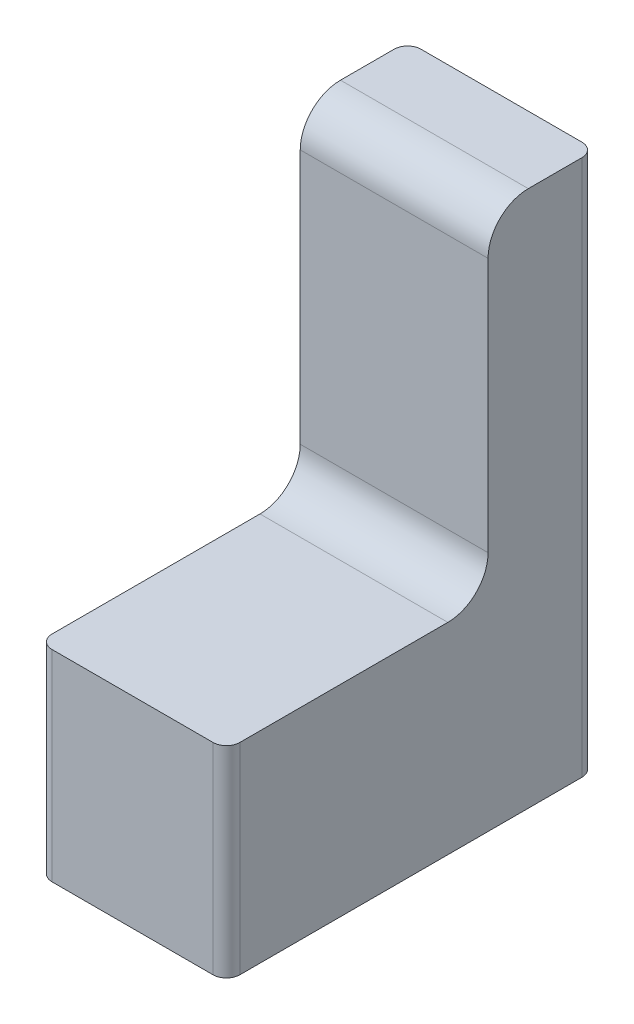
ISO-10303-21;
HEADER;
FILE_DESCRIPTION(('STEP AP214'),'2;1');
FILE_NAME('part.step','',(''),(''),'','','');
FILE_SCHEMA(('AUTOMOTIVE_DESIGN { 1 0 10303 214 1 1 1 1 }'));
ENDSEC;
DATA;
#1=APPLICATION_CONTEXT('core data for automotive mechanical design processes');
#2=APPLICATION_PROTOCOL_DEFINITION('international standard','automotive_design',2000,#1);
#3=PRODUCT_CONTEXT('',#1,'mechanical');
#4=PRODUCT('Part','Part','',(#3));
#5=PRODUCT_RELATED_PRODUCT_CATEGORY('part','',(#4));
#6=PRODUCT_DEFINITION_FORMATION('','',#4);
#7=PRODUCT_DEFINITION_CONTEXT('part definition',#1,'design');
#8=PRODUCT_DEFINITION('design','',#6,#7);
#9=PRODUCT_DEFINITION_SHAPE('','',#8);
#10=(LENGTH_UNIT() NAMED_UNIT(*) SI_UNIT(.MILLI.,.METRE.));
#11=(NAMED_UNIT(*) PLANE_ANGLE_UNIT() SI_UNIT($,.RADIAN.));
#12=(NAMED_UNIT(*) SI_UNIT($,.STERADIAN.) SOLID_ANGLE_UNIT());
#13=UNCERTAINTY_MEASURE_WITH_UNIT(LENGTH_MEASURE(1.E-05),#10,'distance_accuracy_value','');
#14=(GEOMETRIC_REPRESENTATION_CONTEXT(3) GLOBAL_UNCERTAINTY_ASSIGNED_CONTEXT((#13)) GLOBAL_UNIT_ASSIGNED_CONTEXT((#10,
#11,#12)) REPRESENTATION_CONTEXT('',''));
#15=CARTESIAN_POINT('',(0.,0.,0.));
#16=DIRECTION('',(0.,0.,1.));
#17=DIRECTION('',(1.,0.,0.));
#18=AXIS2_PLACEMENT_3D('',#15,#16,#17);
#19=CARTESIAN_POINT('',(7.,-40.,13.75));
#20=DIRECTION('',(1.,0.,0.));
#21=DIRECTION('',(0.,0.,-1.));
#22=AXIS2_PLACEMENT_3D('',#19,#20,#21);
#23=PLANE('',#22);
#24=DIRECTION('',(0.,0.,-1.));
#25=VECTOR('',#24,1.);
#26=CARTESIAN_POINT('',(7.,-40.,13.75));
#27=LINE('',#26,#25);
#28=CARTESIAN_POINT('',(7.,-40.,12.75));
#29=VERTEX_POINT('',#28);
#30=CARTESIAN_POINT('',(7.,-40.,-12.75));
#31=VERTEX_POINT('',#30);
#32=EDGE_CURVE('E184',#29,#31,#27,.T.);
#33=ORIENTED_EDGE('',*,*,#32,.T.);
#34=DIRECTION('',(0.,1.,0.));
#35=VECTOR('',#34,1.);
#36=CARTESIAN_POINT('',(7.,-40.,-12.75));
#37=LINE('',#36,#35);
#38=CARTESIAN_POINT('',(7.,0.,-12.75));
#39=VERTEX_POINT('',#38);
#40=EDGE_CURVE('E248',#31,#39,#37,.T.);
#41=ORIENTED_EDGE('',*,*,#40,.T.);
#42=DIRECTION('',(0.,0.,-1.));
#43=VECTOR('',#42,1.);
#44=CARTESIAN_POINT('',(7.,0.,13.75));
#45=LINE('',#44,#43);
#46=CARTESIAN_POINT('',(7.,0.,-8.75));
#47=VERTEX_POINT('',#46);
#48=EDGE_CURVE('E183',#47,#39,#45,.T.);
#49=ORIENTED_EDGE('',*,*,#48,.F.);
#50=CARTESIAN_POINT('',(7.,-3.,-8.75));
#51=DIRECTION('',(1.,0.,0.));
#52=DIRECTION('',(0.,0.,-1.));
#53=AXIS2_PLACEMENT_3D('',#50,#51,#52);
#54=CIRCLE('',#53,3.);
#55=CARTESIAN_POINT('',(7.,-3.,-5.75));
#56=VERTEX_POINT('',#55);
#57=EDGE_CURVE('E214',#47,#56,#54,.T.);
#58=ORIENTED_EDGE('',*,*,#57,.T.);
#59=DIRECTION('',(0.,1.,0.));
#60=VECTOR('',#59,1.);
#61=CARTESIAN_POINT('',(7.,0.,-5.75));
#62=LINE('',#61,#60);
#63=CARTESIAN_POINT('',(7.,-22.,-5.75));
#64=VERTEX_POINT('',#63);
#65=EDGE_CURVE('E176',#64,#56,#62,.T.);
#66=ORIENTED_EDGE('',*,*,#65,.F.);
#67=CARTESIAN_POINT('',(7.,-22.,-2.75));
#68=DIRECTION('',(1.,0.,0.));
#69=DIRECTION('',(0.,0.,-1.));
#70=AXIS2_PLACEMENT_3D('',#67,#68,#69);
#71=CIRCLE('',#70,3.);
#72=CARTESIAN_POINT('',(7.,-25.,-2.75));
#73=VERTEX_POINT('',#72);
#74=EDGE_CURVE('E219',#64,#73,#71,.F.);
#75=ORIENTED_EDGE('',*,*,#74,.T.);
#76=DIRECTION('',(0.,0.,-1.));
#77=VECTOR('',#76,1.);
#78=CARTESIAN_POINT('',(7.,-25.,13.75));
#79=LINE('',#78,#77);
#80=CARTESIAN_POINT('',(7.,-25.,12.75));
#81=VERTEX_POINT('',#80);
#82=EDGE_CURVE('E174',#81,#73,#79,.T.);
#83=ORIENTED_EDGE('',*,*,#82,.F.);
#84=DIRECTION('',(0.,1.,0.));
#85=VECTOR('',#84,1.);
#86=CARTESIAN_POINT('',(7.,-40.,12.75));
#87=LINE('',#86,#85);
#88=EDGE_CURVE('E246',#81,#29,#87,.F.);
#89=ORIENTED_EDGE('',*,*,#88,.T.);
#90=EDGE_LOOP('',(#33,#41,#49,#58,#66,#75,#83,#89));
#91=FACE_BOUND('',#90,.T.);
#92=ADVANCED_FACE('F53',(#91),#23,.T.);
#93=CARTESIAN_POINT('',(-7.,-40.,13.75));
#94=DIRECTION('',(0.,0.,1.));
#95=DIRECTION('',(1.,0.,0.));
#96=AXIS2_PLACEMENT_3D('',#93,#94,#95);
#97=PLANE('',#96);
#98=DIRECTION('',(1.,0.,0.));
#99=VECTOR('',#98,1.);
#100=CARTESIAN_POINT('',(-7.,-40.,13.75));
#101=LINE('',#100,#99);
#102=CARTESIAN_POINT('',(-6.,-40.,13.75));
#103=VERTEX_POINT('',#102);
#104=CARTESIAN_POINT('',(6.,-40.,13.75));
#105=VERTEX_POINT('',#104);
#106=EDGE_CURVE('E194',#103,#105,#101,.T.);
#107=ORIENTED_EDGE('',*,*,#106,.T.);
#108=DIRECTION('',(0.,1.,0.));
#109=VECTOR('',#108,1.);
#110=CARTESIAN_POINT('',(6.,-40.,13.75));
#111=LINE('',#110,#109);
#112=CARTESIAN_POINT('',(6.,-25.,13.75));
#113=VERTEX_POINT('',#112);
#114=EDGE_CURVE('E253',#105,#113,#111,.T.);
#115=ORIENTED_EDGE('',*,*,#114,.T.);
#116=DIRECTION('',(1.,0.,0.));
#117=VECTOR('',#116,1.);
#118=CARTESIAN_POINT('',(-7.001,-25.,13.75));
#119=LINE('',#118,#117);
#120=CARTESIAN_POINT('',(-6.,-25.,13.75));
#121=VERTEX_POINT('',#120);
#122=EDGE_CURVE('E179',#121,#113,#119,.T.);
#123=ORIENTED_EDGE('',*,*,#122,.F.);
#124=DIRECTION('',(0.,1.,0.));
#125=VECTOR('',#124,1.);
#126=CARTESIAN_POINT('',(-6.,-40.,13.75));
#127=LINE('',#126,#125);
#128=EDGE_CURVE('E251',#121,#103,#127,.F.);
#129=ORIENTED_EDGE('',*,*,#128,.T.);
#130=EDGE_LOOP('',(#107,#115,#123,#129));
#131=FACE_BOUND('',#130,.T.);
#132=ADVANCED_FACE('F255',(#131),#97,.T.);
#133=CARTESIAN_POINT('',(-7.,-40.,13.75));
#134=DIRECTION('',(-1.,0.,0.));
#135=DIRECTION('',(0.,0.,1.));
#136=AXIS2_PLACEMENT_3D('',#133,#134,#135);
#137=PLANE('',#136);
#138=DIRECTION('',(0.,0.,1.));
#139=VECTOR('',#138,1.);
#140=CARTESIAN_POINT('',(-7.,0.,13.75));
#141=LINE('',#140,#139);
#142=CARTESIAN_POINT('',(-7.,0.,-12.75));
#143=VERTEX_POINT('',#142);
#144=CARTESIAN_POINT('',(-7.,0.,-8.75));
#145=VERTEX_POINT('',#144);
#146=EDGE_CURVE('E188',#143,#145,#141,.T.);
#147=ORIENTED_EDGE('',*,*,#146,.F.);
#148=DIRECTION('',(0.,1.,0.));
#149=VECTOR('',#148,1.);
#150=CARTESIAN_POINT('',(-7.,-40.,-12.75));
#151=LINE('',#150,#149);
#152=CARTESIAN_POINT('',(-7.,-40.,-12.75));
#153=VERTEX_POINT('',#152);
#154=EDGE_CURVE('E236',#143,#153,#151,.F.);
#155=ORIENTED_EDGE('',*,*,#154,.T.);
#156=DIRECTION('',(0.,0.,1.));
#157=VECTOR('',#156,1.);
#158=CARTESIAN_POINT('',(-7.,-40.,13.75));
#159=LINE('',#158,#157);
#160=CARTESIAN_POINT('',(-7.,-40.,12.75));
#161=VERTEX_POINT('',#160);
#162=EDGE_CURVE('E191',#153,#161,#159,.T.);
#163=ORIENTED_EDGE('',*,*,#162,.T.);
#164=DIRECTION('',(0.,1.,0.));
#165=VECTOR('',#164,1.);
#166=CARTESIAN_POINT('',(-7.,-40.,12.75));
#167=LINE('',#166,#165);
#168=CARTESIAN_POINT('',(-7.,-25.,12.75));
#169=VERTEX_POINT('',#168);
#170=EDGE_CURVE('E233',#161,#169,#167,.T.);
#171=ORIENTED_EDGE('',*,*,#170,.T.);
#172=DIRECTION('',(0.,0.,-1.));
#173=VECTOR('',#172,1.);
#174=CARTESIAN_POINT('',(-7.,-25.,13.75));
#175=LINE('',#174,#173);
#176=CARTESIAN_POINT('',(-7.,-25.,-2.75));
#177=VERTEX_POINT('',#176);
#178=EDGE_CURVE('E181',#169,#177,#175,.T.);
#179=ORIENTED_EDGE('',*,*,#178,.T.);
#180=CARTESIAN_POINT('',(-7.,-22.,-2.75));
#181=DIRECTION('',(-1.,0.,0.));
#182=DIRECTION('',(0.,0.,1.));
#183=AXIS2_PLACEMENT_3D('',#180,#181,#182);
#184=CIRCLE('',#183,3.);
#185=CARTESIAN_POINT('',(-7.,-22.,-5.75));
#186=VERTEX_POINT('',#185);
#187=EDGE_CURVE('E222',#177,#186,#184,.F.);
#188=ORIENTED_EDGE('',*,*,#187,.T.);
#189=DIRECTION('',(0.,1.,0.));
#190=VECTOR('',#189,1.);
#191=CARTESIAN_POINT('',(-7.,0.,-5.75));
#192=LINE('',#191,#190);
#193=CARTESIAN_POINT('',(-7.,-3.,-5.75));
#194=VERTEX_POINT('',#193);
#195=EDGE_CURVE('E171',#186,#194,#192,.T.);
#196=ORIENTED_EDGE('',*,*,#195,.T.);
#197=CARTESIAN_POINT('',(-7.,-3.,-8.75));
#198=DIRECTION('',(-1.,0.,0.));
#199=DIRECTION('',(0.,0.,1.));
#200=AXIS2_PLACEMENT_3D('',#197,#198,#199);
#201=CIRCLE('',#200,3.);
#202=EDGE_CURVE('E216',#194,#145,#201,.T.);
#203=ORIENTED_EDGE('',*,*,#202,.T.);
#204=EDGE_LOOP('',(#147,#155,#163,#171,#179,#188,#196,#203));
#205=FACE_BOUND('',#204,.T.);
#206=ADVANCED_FACE('F289',(#205),#137,.T.);
#207=CARTESIAN_POINT('',(-7.,-40.,-13.75));
#208=DIRECTION('',(0.,0.,-1.));
#209=DIRECTION('',(-1.,0.,0.));
#210=AXIS2_PLACEMENT_3D('',#207,#208,#209);
#211=PLANE('',#210);
#212=DIRECTION('',(-1.,0.,0.));
#213=VECTOR('',#212,1.);
#214=CARTESIAN_POINT('',(-7.,-40.,-13.75));
#215=LINE('',#214,#213);
#216=CARTESIAN_POINT('',(6.,-40.,-13.75));
#217=VERTEX_POINT('',#216);
#218=CARTESIAN_POINT('',(-6.,-40.,-13.75));
#219=VERTEX_POINT('',#218);
#220=EDGE_CURVE('E187',#217,#219,#215,.T.);
#221=ORIENTED_EDGE('',*,*,#220,.T.);
#222=DIRECTION('',(0.,1.,0.));
#223=VECTOR('',#222,1.);
#224=CARTESIAN_POINT('',(-6.,-40.,-13.75));
#225=LINE('',#224,#223);
#226=CARTESIAN_POINT('',(-6.,0.,-13.75));
#227=VERTEX_POINT('',#226);
#228=EDGE_CURVE('E226',#219,#227,#225,.T.);
#229=ORIENTED_EDGE('',*,*,#228,.T.);
#230=DIRECTION('',(-1.,0.,0.));
#231=VECTOR('',#230,1.);
#232=CARTESIAN_POINT('',(-7.,0.,-13.75));
#233=LINE('',#232,#231);
#234=CARTESIAN_POINT('',(6.,0.,-13.75));
#235=VERTEX_POINT('',#234);
#236=EDGE_CURVE('E200',#235,#227,#233,.T.);
#237=ORIENTED_EDGE('',*,*,#236,.F.);
#238=DIRECTION('',(0.,1.,0.));
#239=VECTOR('',#238,1.);
#240=CARTESIAN_POINT('',(6.,-40.,-13.75));
#241=LINE('',#240,#239);
#242=EDGE_CURVE('E224',#235,#217,#241,.F.);
#243=ORIENTED_EDGE('',*,*,#242,.T.);
#244=EDGE_LOOP('',(#221,#229,#237,#243));
#245=FACE_BOUND('',#244,.T.);
#246=ADVANCED_FACE('F281',(#245),#211,.T.);
#247=CARTESIAN_POINT('',(0.,-40.,0.));
#248=DIRECTION('',(0.,-1.,0.));
#249=DIRECTION('',(0.,0.,-1.));
#250=AXIS2_PLACEMENT_3D('',#247,#248,#249);
#251=PLANE('',#250);
#252=CARTESIAN_POINT('',(0.,-40.,7.75));
#253=DIRECTION('',(0.,-1.,0.));
#254=DIRECTION('',(0.,0.,-1.));
#255=AXIS2_PLACEMENT_3D('',#252,#253,#254);
#256=CIRCLE('',#255,3.025);
#257=CARTESIAN_POINT('',(0.,-40.,4.725));
#258=VERTEX_POINT('',#257);
#259=EDGE_CURVE('E162',#258,#258,#256,.T.);
#260=ORIENTED_EDGE('',*,*,#259,.F.);
#261=EDGE_LOOP('',(#260));
#262=FACE_BOUND('',#261,.T.);
#263=CARTESIAN_POINT('',(0.,-40.,-7.75));
#264=DIRECTION('',(0.,-1.,0.));
#265=DIRECTION('',(0.,0.,-1.));
#266=AXIS2_PLACEMENT_3D('',#263,#264,#265);
#267=CIRCLE('',#266,3.025);
#268=CARTESIAN_POINT('',(0.,-40.,-10.775));
#269=VERTEX_POINT('',#268);
#270=EDGE_CURVE('E155',#269,#269,#267,.T.);
#271=ORIENTED_EDGE('',*,*,#270,.F.);
#272=EDGE_LOOP('',(#271));
#273=FACE_BOUND('',#272,.T.);
#274=ORIENTED_EDGE('',*,*,#162,.F.);
#275=CARTESIAN_POINT('',(-6.,-40.,-12.75));
#276=DIRECTION('',(0.,-1.,0.));
#277=DIRECTION('',(0.,0.,-1.));
#278=AXIS2_PLACEMENT_3D('',#275,#276,#277);
#279=CIRCLE('',#278,1.);
#280=EDGE_CURVE('E244',#153,#219,#279,.T.);
#281=ORIENTED_EDGE('',*,*,#280,.T.);
#282=ORIENTED_EDGE('',*,*,#220,.F.);
#283=CARTESIAN_POINT('',(6.,-40.,-12.75));
#284=DIRECTION('',(0.,-1.,0.));
#285=DIRECTION('',(0.,0.,-1.));
#286=AXIS2_PLACEMENT_3D('',#283,#284,#285);
#287=CIRCLE('',#286,1.);
#288=EDGE_CURVE('E242',#217,#31,#287,.T.);
#289=ORIENTED_EDGE('',*,*,#288,.T.);
#290=ORIENTED_EDGE('',*,*,#32,.F.);
#291=CARTESIAN_POINT('',(6.,-40.,12.75));
#292=DIRECTION('',(0.,-1.,0.));
#293=DIRECTION('',(0.,0.,-1.));
#294=AXIS2_PLACEMENT_3D('',#291,#292,#293);
#295=CIRCLE('',#294,1.);
#296=EDGE_CURVE('E240',#29,#105,#295,.T.);
#297=ORIENTED_EDGE('',*,*,#296,.T.);
#298=ORIENTED_EDGE('',*,*,#106,.F.);
#299=CARTESIAN_POINT('',(-6.,-40.,12.75));
#300=DIRECTION('',(0.,-1.,0.));
#301=DIRECTION('',(0.,0.,-1.));
#302=AXIS2_PLACEMENT_3D('',#299,#300,#301);
#303=CIRCLE('',#302,1.);
#304=EDGE_CURVE('E238',#103,#161,#303,.T.);
#305=ORIENTED_EDGE('',*,*,#304,.T.);
#306=EDGE_LOOP('',(#274,#281,#282,#289,#290,#297,#298,#305));
#307=FACE_BOUND('',#306,.T.);
#308=ADVANCED_FACE('F268',(#262,#273,#307),#251,.T.);
#309=CARTESIAN_POINT('',(0.,0.,0.));
#310=DIRECTION('',(0.,-1.,0.));
#311=DIRECTION('',(0.,0.,-1.));
#312=AXIS2_PLACEMENT_3D('',#309,#310,#311);
#313=PLANE('',#312);
#314=ORIENTED_EDGE('',*,*,#236,.T.);
#315=CARTESIAN_POINT('',(-6.,0.,-12.75));
#316=DIRECTION('',(0.,-1.,0.));
#317=DIRECTION('',(0.,0.,-1.));
#318=AXIS2_PLACEMENT_3D('',#315,#316,#317);
#319=CIRCLE('',#318,1.);
#320=EDGE_CURVE('E231',#227,#143,#319,.F.);
#321=ORIENTED_EDGE('',*,*,#320,.T.);
#322=ORIENTED_EDGE('',*,*,#146,.T.);
#323=DIRECTION('',(1.,0.,0.));
#324=VECTOR('',#323,1.);
#325=CARTESIAN_POINT('',(0.,0.,-8.75));
#326=LINE('',#325,#324);
#327=EDGE_CURVE('E211',#145,#47,#326,.T.);
#328=ORIENTED_EDGE('',*,*,#327,.T.);
#329=ORIENTED_EDGE('',*,*,#48,.T.);
#330=CARTESIAN_POINT('',(6.,0.,-12.75));
#331=DIRECTION('',(0.,-1.,0.));
#332=DIRECTION('',(0.,0.,-1.));
#333=AXIS2_PLACEMENT_3D('',#330,#331,#332);
#334=CIRCLE('',#333,1.);
#335=EDGE_CURVE('E229',#39,#235,#334,.F.);
#336=ORIENTED_EDGE('',*,*,#335,.T.);
#337=EDGE_LOOP('',(#314,#321,#322,#328,#329,#336));
#338=FACE_BOUND('',#337,.T.);
#339=ADVANCED_FACE('F279',(#338),#313,.F.);
#340=CARTESIAN_POINT('',(-7.001,0.,-5.75));
#341=DIRECTION('',(0.,0.,-1.));
#342=DIRECTION('',(0.,1.,0.));
#343=AXIS2_PLACEMENT_3D('',#340,#341,#342);
#344=PLANE('',#343);
#345=ORIENTED_EDGE('',*,*,#195,.F.);
#346=DIRECTION('',(1.,0.,0.));
#347=VECTOR('',#346,1.);
#348=CARTESIAN_POINT('',(7.,-22.,-5.75));
#349=LINE('',#348,#347);
#350=EDGE_CURVE('E205',#186,#64,#349,.T.);
#351=ORIENTED_EDGE('',*,*,#350,.T.);
#352=ORIENTED_EDGE('',*,*,#65,.T.);
#353=DIRECTION('',(1.,0.,0.));
#354=VECTOR('',#353,1.);
#355=CARTESIAN_POINT('',(-7.001,-3.,-5.75));
#356=LINE('',#355,#354);
#357=EDGE_CURVE('E197',#56,#194,#356,.F.);
#358=ORIENTED_EDGE('',*,*,#357,.T.);
#359=EDGE_LOOP('',(#345,#351,#352,#358));
#360=FACE_BOUND('',#359,.T.);
#361=ADVANCED_FACE('F297',(#360),#344,.F.);
#362=CARTESIAN_POINT('',(-7.001,-25.,13.75));
#363=DIRECTION('',(0.,-1.,0.));
#364=DIRECTION('',(0.,0.,-1.));
#365=AXIS2_PLACEMENT_3D('',#362,#363,#364);
#366=PLANE('',#365);
#367=ORIENTED_EDGE('',*,*,#122,.T.);
#368=CARTESIAN_POINT('',(6.,-25.,12.75));
#369=DIRECTION('',(0.,-1.,0.));
#370=DIRECTION('',(0.,0.,-1.));
#371=AXIS2_PLACEMENT_3D('',#368,#369,#370);
#372=CIRCLE('',#371,1.);
#373=EDGE_CURVE('E11',#113,#81,#372,.F.);
#374=ORIENTED_EDGE('',*,*,#373,.T.);
#375=ORIENTED_EDGE('',*,*,#82,.T.);
#376=DIRECTION('',(1.,0.,0.));
#377=VECTOR('',#376,1.);
#378=CARTESIAN_POINT('',(-7.,-25.,-2.75));
#379=LINE('',#378,#377);
#380=EDGE_CURVE('E208',#73,#177,#379,.F.);
#381=ORIENTED_EDGE('',*,*,#380,.T.);
#382=ORIENTED_EDGE('',*,*,#178,.F.);
#383=CARTESIAN_POINT('',(-6.,-25.,12.75));
#384=DIRECTION('',(0.,-1.,0.));
#385=DIRECTION('',(0.,0.,-1.));
#386=AXIS2_PLACEMENT_3D('',#383,#384,#385);
#387=CIRCLE('',#386,1.);
#388=EDGE_CURVE('E61',#169,#121,#387,.F.);
#389=ORIENTED_EDGE('',*,*,#388,.T.);
#390=EDGE_LOOP('',(#367,#374,#375,#381,#382,#389));
#391=FACE_BOUND('',#390,.T.);
#392=ADVANCED_FACE('F259',(#391),#366,.F.);
#393=CARTESIAN_POINT('',(-7.001,-22.,-2.75));
#394=DIRECTION('',(-1.,0.,0.));
#395=DIRECTION('',(0.,0.,1.));
#396=AXIS2_PLACEMENT_3D('',#393,#394,#395);
#397=CYLINDRICAL_SURFACE('',#396,3.);
#398=ORIENTED_EDGE('',*,*,#187,.F.);
#399=ORIENTED_EDGE('',*,*,#380,.F.);
#400=ORIENTED_EDGE('',*,*,#74,.F.);
#401=ORIENTED_EDGE('',*,*,#350,.F.);
#402=EDGE_LOOP('',(#398,#399,#400,#401));
#403=FACE_BOUND('',#402,.T.);
#404=ADVANCED_FACE('F301',(#403),#397,.F.);
#405=CARTESIAN_POINT('',(0.,-3.,-8.75));
#406=DIRECTION('',(1.,0.,0.));
#407=DIRECTION('',(0.,0.,-1.));
#408=AXIS2_PLACEMENT_3D('',#405,#406,#407);
#409=CYLINDRICAL_SURFACE('',#408,3.);
#410=ORIENTED_EDGE('',*,*,#202,.F.);
#411=ORIENTED_EDGE('',*,*,#357,.F.);
#412=ORIENTED_EDGE('',*,*,#57,.F.);
#413=ORIENTED_EDGE('',*,*,#327,.F.);
#414=EDGE_LOOP('',(#410,#411,#412,#413));
#415=FACE_BOUND('',#414,.T.);
#416=ADVANCED_FACE('F295',(#415),#409,.T.);
#417=CARTESIAN_POINT('',(0.,-28.,-7.75));
#418=DIRECTION('',(0.,-1.,0.));
#419=DIRECTION('',(0.,0.,-1.));
#420=AXIS2_PLACEMENT_3D('',#417,#418,#419);
#421=CONICAL_SURFACE('',#420,2.5,1.02974425867665);
#422=CARTESIAN_POINT('',(0.,-26.4978484524311,-7.75));
#423=VERTEX_POINT('',#422);
#424=VERTEX_LOOP('',#423);
#425=FACE_BOUND('',#424,.T.);
#426=CARTESIAN_POINT('',(0.,-28.,-7.75));
#427=DIRECTION('',(0.,-1.,0.));
#428=DIRECTION('',(0.,0.,-1.));
#429=AXIS2_PLACEMENT_3D('',#426,#427,#428);
#430=CIRCLE('',#429,2.5);
#431=CARTESIAN_POINT('',(0.,-28.,-10.25));
#432=VERTEX_POINT('',#431);
#433=EDGE_CURVE('E168',#432,#432,#430,.T.);
#434=ORIENTED_EDGE('',*,*,#433,.T.);
#435=EDGE_LOOP('',(#434));
#436=FACE_BOUND('',#435,.T.);
#437=ADVANCED_FACE('F322',(#425,#436),#421,.F.);
#438=CARTESIAN_POINT('',(0.,-40.,-7.75));
#439=DIRECTION('',(0.,-1.,0.));
#440=DIRECTION('',(0.,0.,-1.));
#441=AXIS2_PLACEMENT_3D('',#438,#439,#440);
#442=CYLINDRICAL_SURFACE('',#441,2.49999999999999);
#443=ORIENTED_EDGE('',*,*,#433,.F.);
#444=EDGE_LOOP('',(#443));
#445=FACE_BOUND('',#444,.T.);
#446=CARTESIAN_POINT('',(0.,-39.475,-7.75));
#447=DIRECTION('',(0.,-1.,0.));
#448=DIRECTION('',(0.,0.,-1.));
#449=AXIS2_PLACEMENT_3D('',#446,#447,#448);
#450=CIRCLE('',#449,2.49999999999999);
#451=CARTESIAN_POINT('',(0.,-39.475,-10.25));
#452=VERTEX_POINT('',#451);
#453=EDGE_CURVE('E159',#452,#452,#450,.T.);
#454=ORIENTED_EDGE('',*,*,#453,.T.);
#455=EDGE_LOOP('',(#454));
#456=FACE_BOUND('',#455,.T.);
#457=ADVANCED_FACE('F376',(#445,#456),#442,.F.);
#458=CARTESIAN_POINT('',(0.,-40.,-7.75));
#459=DIRECTION('',(0.,-1.,0.));
#460=DIRECTION('',(0.,0.,-1.));
#461=AXIS2_PLACEMENT_3D('',#458,#459,#460);
#462=CONICAL_SURFACE('',#461,3.025,0.785398163397447);
#463=ORIENTED_EDGE('',*,*,#453,.F.);
#464=EDGE_LOOP('',(#463));
#465=FACE_BOUND('',#464,.T.);
#466=ORIENTED_EDGE('',*,*,#270,.T.);
#467=EDGE_LOOP('',(#466));
#468=FACE_BOUND('',#467,.T.);
#469=ADVANCED_FACE('F149',(#465,#468),#462,.F.);
#470=CARTESIAN_POINT('',(0.,-28.,7.75));
#471=DIRECTION('',(0.,-1.,0.));
#472=DIRECTION('',(0.,0.,-1.));
#473=AXIS2_PLACEMENT_3D('',#470,#471,#472);
#474=CONICAL_SURFACE('',#473,2.5,1.02974425867665);
#475=CARTESIAN_POINT('',(0.,-26.4978484524311,7.75));
#476=VERTEX_POINT('',#475);
#477=VERTEX_LOOP('',#476);
#478=FACE_BOUND('',#477,.T.);
#479=CARTESIAN_POINT('',(0.,-28.,7.75));
#480=DIRECTION('',(0.,-1.,0.));
#481=DIRECTION('',(0.,0.,-1.));
#482=AXIS2_PLACEMENT_3D('',#479,#480,#481);
#483=CIRCLE('',#482,2.5);
#484=CARTESIAN_POINT('',(0.,-28.,5.25000000000001));
#485=VERTEX_POINT('',#484);
#486=EDGE_CURVE('E153',#485,#485,#483,.T.);
#487=ORIENTED_EDGE('',*,*,#486,.T.);
#488=EDGE_LOOP('',(#487));
#489=FACE_BOUND('',#488,.T.);
#490=ADVANCED_FACE('F145',(#478,#489),#474,.F.);
#491=CARTESIAN_POINT('',(0.,-40.,7.75));
#492=DIRECTION('',(0.,-1.,0.));
#493=DIRECTION('',(0.,0.,-1.));
#494=AXIS2_PLACEMENT_3D('',#491,#492,#493);
#495=CYLINDRICAL_SURFACE('',#494,2.49999999999999);
#496=ORIENTED_EDGE('',*,*,#486,.F.);
#497=EDGE_LOOP('',(#496));
#498=FACE_BOUND('',#497,.T.);
#499=CARTESIAN_POINT('',(0.,-39.475,7.75));
#500=DIRECTION('',(0.,-1.,0.));
#501=DIRECTION('',(0.,0.,-1.));
#502=AXIS2_PLACEMENT_3D('',#499,#500,#501);
#503=CIRCLE('',#502,2.49999999999999);
#504=CARTESIAN_POINT('',(0.,-39.475,5.25000000000001));
#505=VERTEX_POINT('',#504);
#506=EDGE_CURVE('E156',#505,#505,#503,.T.);
#507=ORIENTED_EDGE('',*,*,#506,.T.);
#508=EDGE_LOOP('',(#507));
#509=FACE_BOUND('',#508,.T.);
#510=ADVANCED_FACE('F148',(#498,#509),#495,.F.);
#511=CARTESIAN_POINT('',(0.,-40.,7.75));
#512=DIRECTION('',(0.,-1.,0.));
#513=DIRECTION('',(0.,0.,-1.));
#514=AXIS2_PLACEMENT_3D('',#511,#512,#513);
#515=CONICAL_SURFACE('',#514,3.025,0.785398163397447);
#516=ORIENTED_EDGE('',*,*,#506,.F.);
#517=EDGE_LOOP('',(#516));
#518=FACE_BOUND('',#517,.T.);
#519=ORIENTED_EDGE('',*,*,#259,.T.);
#520=EDGE_LOOP('',(#519));
#521=FACE_BOUND('',#520,.T.);
#522=ADVANCED_FACE('F325',(#518,#521),#515,.F.);
#523=CARTESIAN_POINT('',(-6.,-40.,-12.75));
#524=DIRECTION('',(0.,1.,0.));
#525=DIRECTION('',(0.,0.,1.));
#526=AXIS2_PLACEMENT_3D('',#523,#524,#525);
#527=CYLINDRICAL_SURFACE('',#526,1.);
#528=ORIENTED_EDGE('',*,*,#280,.F.);
#529=ORIENTED_EDGE('',*,*,#154,.F.);
#530=ORIENTED_EDGE('',*,*,#320,.F.);
#531=ORIENTED_EDGE('',*,*,#228,.F.);
#532=EDGE_LOOP('',(#528,#529,#530,#531));
#533=FACE_BOUND('',#532,.T.);
#534=ADVANCED_FACE('F285',(#533),#527,.T.);
#535=CARTESIAN_POINT('',(6.,-40.,-12.75));
#536=DIRECTION('',(0.,1.,0.));
#537=DIRECTION('',(0.,0.,1.));
#538=AXIS2_PLACEMENT_3D('',#535,#536,#537);
#539=CYLINDRICAL_SURFACE('',#538,1.);
#540=ORIENTED_EDGE('',*,*,#288,.F.);
#541=ORIENTED_EDGE('',*,*,#242,.F.);
#542=ORIENTED_EDGE('',*,*,#335,.F.);
#543=ORIENTED_EDGE('',*,*,#40,.F.);
#544=EDGE_LOOP('',(#540,#541,#542,#543));
#545=FACE_BOUND('',#544,.T.);
#546=ADVANCED_FACE('F275',(#545),#539,.T.);
#547=CARTESIAN_POINT('',(6.,-40.,12.75));
#548=DIRECTION('',(0.,1.,0.));
#549=DIRECTION('',(0.,0.,1.));
#550=AXIS2_PLACEMENT_3D('',#547,#548,#549);
#551=CYLINDRICAL_SURFACE('',#550,1.);
#552=ORIENTED_EDGE('',*,*,#296,.F.);
#553=ORIENTED_EDGE('',*,*,#88,.F.);
#554=ORIENTED_EDGE('',*,*,#373,.F.);
#555=ORIENTED_EDGE('',*,*,#114,.F.);
#556=EDGE_LOOP('',(#552,#553,#554,#555));
#557=FACE_BOUND('',#556,.T.);
#558=ADVANCED_FACE('F265',(#557),#551,.T.);
#559=CARTESIAN_POINT('',(-6.,-40.,12.75));
#560=DIRECTION('',(0.,1.,0.));
#561=DIRECTION('',(0.,0.,1.));
#562=AXIS2_PLACEMENT_3D('',#559,#560,#561);
#563=CYLINDRICAL_SURFACE('',#562,1.);
#564=ORIENTED_EDGE('',*,*,#304,.F.);
#565=ORIENTED_EDGE('',*,*,#128,.F.);
#566=ORIENTED_EDGE('',*,*,#388,.F.);
#567=ORIENTED_EDGE('',*,*,#170,.F.);
#568=EDGE_LOOP('',(#564,#565,#566,#567));
#569=FACE_BOUND('',#568,.T.);
#570=ADVANCED_FACE('F55',(#569),#563,.T.);
#571=CLOSED_SHELL('',(#92,#132,#206,#246,#308,#339,#361,#392,#404,#416,#437,#457,#469,#490,#510,
#522,#534,#546,#558,#570));
#572=MANIFOLD_SOLID_BREP('B2',#571);
#573=ADVANCED_BREP_SHAPE_REPRESENTATION('',(#18,#572),#14);
#574=SHAPE_DEFINITION_REPRESENTATION(#9,#573);
ENDSEC;
END-ISO-10303-21;
